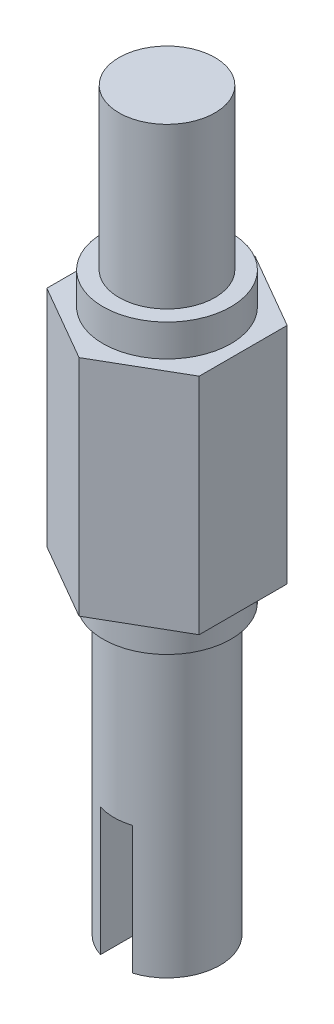
ISO-10303-21;
HEADER;
FILE_DESCRIPTION(('STEP AP214'),'2;1');
FILE_NAME('part.step','',(''),(''),'','','');
FILE_SCHEMA(('AUTOMOTIVE_DESIGN { 1 0 10303 214 1 1 1 1 }'));
ENDSEC;
DATA;
#1=APPLICATION_CONTEXT('core data for automotive mechanical design processes');
#2=APPLICATION_PROTOCOL_DEFINITION('international standard','automotive_design',2000,#1);
#3=PRODUCT_CONTEXT('',#1,'mechanical');
#4=PRODUCT('Part','Part','',(#3));
#5=PRODUCT_RELATED_PRODUCT_CATEGORY('part','',(#4));
#6=PRODUCT_DEFINITION_FORMATION('','',#4);
#7=PRODUCT_DEFINITION_CONTEXT('part definition',#1,'design');
#8=PRODUCT_DEFINITION('design','',#6,#7);
#9=PRODUCT_DEFINITION_SHAPE('','',#8);
#10=(LENGTH_UNIT() NAMED_UNIT(*) SI_UNIT(.MILLI.,.METRE.));
#11=(NAMED_UNIT(*) PLANE_ANGLE_UNIT() SI_UNIT($,.RADIAN.));
#12=(NAMED_UNIT(*) SI_UNIT($,.STERADIAN.) SOLID_ANGLE_UNIT());
#13=UNCERTAINTY_MEASURE_WITH_UNIT(LENGTH_MEASURE(1.E-05),#10,'distance_accuracy_value','');
#14=(GEOMETRIC_REPRESENTATION_CONTEXT(3) GLOBAL_UNCERTAINTY_ASSIGNED_CONTEXT((#13)) GLOBAL_UNIT_ASSIGNED_CONTEXT((#10,
#11,#12)) REPRESENTATION_CONTEXT('',''));
#15=CARTESIAN_POINT('',(0.,0.,0.));
#16=DIRECTION('',(0.,0.,1.));
#17=DIRECTION('',(1.,0.,0.));
#18=AXIS2_PLACEMENT_3D('',#15,#16,#17);
#19=CARTESIAN_POINT('',(0.,14.,5.49926131403119));
#20=DIRECTION('',(-0.5,0.,-0.866025403784438));
#21=DIRECTION('',(-0.866025403784438,0.,0.5));
#22=AXIS2_PLACEMENT_3D('',#19,#20,#21);
#23=PLANE('',#22);
#24=DIRECTION('',(0.866025403784438,0.,-0.5));
#25=VECTOR('',#24,1.);
#26=CARTESIAN_POINT('',(0.,0.,5.49926131403119));
#27=LINE('',#26,#25);
#28=CARTESIAN_POINT('',(0.,0.,5.49926131403119));
#29=VERTEX_POINT('',#28);
#30=CARTESIAN_POINT('',(4.7625,0.,2.74963065701559));
#31=VERTEX_POINT('',#30);
#32=EDGE_CURVE('E192',#29,#31,#27,.T.);
#33=ORIENTED_EDGE('',*,*,#32,.T.);
#34=DIRECTION('',(0.,-1.,0.));
#35=VECTOR('',#34,1.);
#36=CARTESIAN_POINT('',(4.7625,14.,2.74963065701559));
#37=LINE('',#36,#35);
#38=CARTESIAN_POINT('',(4.7625,14.,2.74963065701559));
#39=VERTEX_POINT('',#38);
#40=EDGE_CURVE('E196',#39,#31,#37,.T.);
#41=ORIENTED_EDGE('',*,*,#40,.F.);
#42=DIRECTION('',(0.866025403784438,0.,-0.5));
#43=VECTOR('',#42,1.);
#44=CARTESIAN_POINT('',(0.,14.,5.49926131403119));
#45=LINE('',#44,#43);
#46=CARTESIAN_POINT('',(0.,14.,5.49926131403119));
#47=VERTEX_POINT('',#46);
#48=EDGE_CURVE('E197',#47,#39,#45,.T.);
#49=ORIENTED_EDGE('',*,*,#48,.F.);
#50=DIRECTION('',(0.,-1.,0.));
#51=VECTOR('',#50,1.);
#52=CARTESIAN_POINT('',(0.,14.,5.49926131403119));
#53=LINE('',#52,#51);
#54=EDGE_CURVE('E217',#47,#29,#53,.T.);
#55=ORIENTED_EDGE('',*,*,#54,.T.);
#56=EDGE_LOOP('',(#33,#41,#49,#55));
#57=FACE_BOUND('',#56,.T.);
#58=ADVANCED_FACE('F58',(#57),#23,.F.);
#59=CARTESIAN_POINT('',(4.7625,14.,2.74963065701559));
#60=DIRECTION('',(-1.,0.,0.));
#61=DIRECTION('',(0.,0.,1.));
#62=AXIS2_PLACEMENT_3D('',#59,#60,#61);
#63=PLANE('',#62);
#64=DIRECTION('',(0.,0.,-1.));
#65=VECTOR('',#64,1.);
#66=CARTESIAN_POINT('',(4.7625,0.,2.74963065701559));
#67=LINE('',#66,#65);
#68=CARTESIAN_POINT('',(4.7625,0.,-2.7496306570156));
#69=VERTEX_POINT('',#68);
#70=EDGE_CURVE('E221',#31,#69,#67,.T.);
#71=ORIENTED_EDGE('',*,*,#70,.T.);
#72=DIRECTION('',(0.,-1.,0.));
#73=VECTOR('',#72,1.);
#74=CARTESIAN_POINT('',(4.7625,14.,-2.7496306570156));
#75=LINE('',#74,#73);
#76=CARTESIAN_POINT('',(4.7625,14.,-2.7496306570156));
#77=VERTEX_POINT('',#76);
#78=EDGE_CURVE('E250',#77,#69,#75,.T.);
#79=ORIENTED_EDGE('',*,*,#78,.F.);
#80=DIRECTION('',(0.,0.,-1.));
#81=VECTOR('',#80,1.);
#82=CARTESIAN_POINT('',(4.7625,14.,2.74963065701559));
#83=LINE('',#82,#81);
#84=EDGE_CURVE('E201',#39,#77,#83,.T.);
#85=ORIENTED_EDGE('',*,*,#84,.F.);
#86=ORIENTED_EDGE('',*,*,#40,.T.);
#87=EDGE_LOOP('',(#71,#79,#85,#86));
#88=FACE_BOUND('',#87,.T.);
#89=ADVANCED_FACE('F286',(#88),#63,.F.);
#90=CARTESIAN_POINT('',(4.7625,14.,-2.7496306570156));
#91=DIRECTION('',(-0.5,0.,0.866025403784439));
#92=DIRECTION('',(0.866025403784439,0.,0.5));
#93=AXIS2_PLACEMENT_3D('',#90,#91,#92);
#94=PLANE('',#93);
#95=DIRECTION('',(-0.866025403784439,0.,-0.5));
#96=VECTOR('',#95,1.);
#97=CARTESIAN_POINT('',(4.7625,0.,-2.7496306570156));
#98=LINE('',#97,#96);
#99=CARTESIAN_POINT('',(0.,0.,-5.49926131403119));
#100=VERTEX_POINT('',#99);
#101=EDGE_CURVE('E224',#69,#100,#98,.T.);
#102=ORIENTED_EDGE('',*,*,#101,.T.);
#103=DIRECTION('',(0.,-1.,0.));
#104=VECTOR('',#103,1.);
#105=CARTESIAN_POINT('',(0.,14.,-5.49926131403119));
#106=LINE('',#105,#104);
#107=CARTESIAN_POINT('',(0.,14.,-5.49926131403119));
#108=VERTEX_POINT('',#107);
#109=EDGE_CURVE('E246',#108,#100,#106,.T.);
#110=ORIENTED_EDGE('',*,*,#109,.F.);
#111=DIRECTION('',(-0.866025403784439,0.,-0.5));
#112=VECTOR('',#111,1.);
#113=CARTESIAN_POINT('',(4.7625,14.,-2.7496306570156));
#114=LINE('',#113,#112);
#115=EDGE_CURVE('E205',#77,#108,#114,.T.);
#116=ORIENTED_EDGE('',*,*,#115,.F.);
#117=ORIENTED_EDGE('',*,*,#78,.T.);
#118=EDGE_LOOP('',(#102,#110,#116,#117));
#119=FACE_BOUND('',#118,.T.);
#120=ADVANCED_FACE('F291',(#119),#94,.F.);
#121=CARTESIAN_POINT('',(0.,14.,-5.49926131403119));
#122=DIRECTION('',(0.5,0.,0.866025403784439));
#123=DIRECTION('',(0.866025403784439,0.,-0.5));
#124=AXIS2_PLACEMENT_3D('',#121,#122,#123);
#125=PLANE('',#124);
#126=DIRECTION('',(-0.866025403784439,0.,0.5));
#127=VECTOR('',#126,1.);
#128=CARTESIAN_POINT('',(0.,0.,-5.49926131403119));
#129=LINE('',#128,#127);
#130=CARTESIAN_POINT('',(-4.7625,0.,-2.74963065701559));
#131=VERTEX_POINT('',#130);
#132=EDGE_CURVE('E227',#100,#131,#129,.T.);
#133=ORIENTED_EDGE('',*,*,#132,.T.);
#134=DIRECTION('',(0.,-1.,0.));
#135=VECTOR('',#134,1.);
#136=CARTESIAN_POINT('',(-4.7625,14.,-2.74963065701559));
#137=LINE('',#136,#135);
#138=CARTESIAN_POINT('',(-4.7625,14.,-2.74963065701559));
#139=VERTEX_POINT('',#138);
#140=EDGE_CURVE('E242',#139,#131,#137,.T.);
#141=ORIENTED_EDGE('',*,*,#140,.F.);
#142=DIRECTION('',(-0.866025403784439,0.,0.5));
#143=VECTOR('',#142,1.);
#144=CARTESIAN_POINT('',(0.,14.,-5.49926131403119));
#145=LINE('',#144,#143);
#146=EDGE_CURVE('E208',#108,#139,#145,.T.);
#147=ORIENTED_EDGE('',*,*,#146,.F.);
#148=ORIENTED_EDGE('',*,*,#109,.T.);
#149=EDGE_LOOP('',(#133,#141,#147,#148));
#150=FACE_BOUND('',#149,.T.);
#151=ADVANCED_FACE('F316',(#150),#125,.F.);
#152=CARTESIAN_POINT('',(-4.7625,14.,-2.74963065701559));
#153=DIRECTION('',(1.,0.,0.));
#154=DIRECTION('',(0.,0.,-1.));
#155=AXIS2_PLACEMENT_3D('',#152,#153,#154);
#156=PLANE('',#155);
#157=DIRECTION('',(0.,0.,1.));
#158=VECTOR('',#157,1.);
#159=CARTESIAN_POINT('',(-4.7625,0.,-2.74963065701559));
#160=LINE('',#159,#158);
#161=CARTESIAN_POINT('',(-4.7625,0.,2.74963065701559));
#162=VERTEX_POINT('',#161);
#163=EDGE_CURVE('E230',#131,#162,#160,.T.);
#164=ORIENTED_EDGE('',*,*,#163,.T.);
#165=DIRECTION('',(0.,-1.,0.));
#166=VECTOR('',#165,1.);
#167=CARTESIAN_POINT('',(-4.7625,14.,2.74963065701559));
#168=LINE('',#167,#166);
#169=CARTESIAN_POINT('',(-4.7625,14.,2.74963065701559));
#170=VERTEX_POINT('',#169);
#171=EDGE_CURVE('E238',#170,#162,#168,.T.);
#172=ORIENTED_EDGE('',*,*,#171,.F.);
#173=DIRECTION('',(0.,0.,1.));
#174=VECTOR('',#173,1.);
#175=CARTESIAN_POINT('',(-4.7625,14.,-2.74963065701559));
#176=LINE('',#175,#174);
#177=EDGE_CURVE('E211',#139,#170,#176,.T.);
#178=ORIENTED_EDGE('',*,*,#177,.F.);
#179=ORIENTED_EDGE('',*,*,#140,.T.);
#180=EDGE_LOOP('',(#164,#172,#178,#179));
#181=FACE_BOUND('',#180,.T.);
#182=ADVANCED_FACE('F313',(#181),#156,.F.);
#183=CARTESIAN_POINT('',(-4.7625,14.,2.74963065701559));
#184=DIRECTION('',(0.5,0.,-0.866025403784439));
#185=DIRECTION('',(-0.866025403784439,0.,-0.5));
#186=AXIS2_PLACEMENT_3D('',#183,#184,#185);
#187=PLANE('',#186);
#188=DIRECTION('',(0.866025403784439,0.,0.5));
#189=VECTOR('',#188,1.);
#190=CARTESIAN_POINT('',(-4.7625,0.,2.74963065701559));
#191=LINE('',#190,#189);
#192=EDGE_CURVE('E202',#162,#29,#191,.T.);
#193=ORIENTED_EDGE('',*,*,#192,.T.);
#194=ORIENTED_EDGE('',*,*,#54,.F.);
#195=DIRECTION('',(0.866025403784439,0.,0.5));
#196=VECTOR('',#195,1.);
#197=CARTESIAN_POINT('',(-4.7625,14.,2.74963065701559));
#198=LINE('',#197,#196);
#199=EDGE_CURVE('E214',#170,#47,#198,.T.);
#200=ORIENTED_EDGE('',*,*,#199,.F.);
#201=ORIENTED_EDGE('',*,*,#171,.T.);
#202=EDGE_LOOP('',(#193,#194,#200,#201));
#203=FACE_BOUND('',#202,.T.);
#204=ADVANCED_FACE('F311',(#203),#187,.F.);
#205=CARTESIAN_POINT('',(0.,14.,0.));
#206=DIRECTION('',(0.,1.,0.));
#207=DIRECTION('',(0.,0.,1.));
#208=AXIS2_PLACEMENT_3D('',#205,#206,#207);
#209=PLANE('',#208);
#210=CARTESIAN_POINT('',(0.,14.,0.));
#211=DIRECTION('',(0.,1.,0.));
#212=DIRECTION('',(0.,0.,1.));
#213=AXIS2_PLACEMENT_3D('',#210,#211,#212);
#214=CIRCLE('',#213,4.);
#215=CARTESIAN_POINT('',(0.,14.,4.));
#216=VERTEX_POINT('',#215);
#217=EDGE_CURVE('E180',#216,#216,#214,.T.);
#218=ORIENTED_EDGE('',*,*,#217,.F.);
#219=EDGE_LOOP('',(#218));
#220=FACE_BOUND('',#219,.T.);
#221=ORIENTED_EDGE('',*,*,#48,.T.);
#222=ORIENTED_EDGE('',*,*,#84,.T.);
#223=ORIENTED_EDGE('',*,*,#115,.T.);
#224=ORIENTED_EDGE('',*,*,#146,.T.);
#225=ORIENTED_EDGE('',*,*,#177,.T.);
#226=ORIENTED_EDGE('',*,*,#199,.T.);
#227=EDGE_LOOP('',(#221,#222,#223,#224,#225,#226));
#228=FACE_BOUND('',#227,.T.);
#229=ADVANCED_FACE('F306',(#220,#228),#209,.T.);
#230=CARTESIAN_POINT('',(0.,0.,0.));
#231=DIRECTION('',(0.,1.,0.));
#232=DIRECTION('',(0.,0.,1.));
#233=AXIS2_PLACEMENT_3D('',#230,#231,#232);
#234=PLANE('',#233);
#235=CARTESIAN_POINT('',(0.,0.,0.));
#236=DIRECTION('',(0.,-1.,0.));
#237=DIRECTION('',(0.,0.,-1.));
#238=AXIS2_PLACEMENT_3D('',#235,#236,#237);
#239=CIRCLE('',#238,4.);
#240=CARTESIAN_POINT('',(0.,0.,-4.));
#241=VERTEX_POINT('',#240);
#242=EDGE_CURVE('E184',#241,#241,#239,.T.);
#243=ORIENTED_EDGE('',*,*,#242,.F.);
#244=EDGE_LOOP('',(#243));
#245=FACE_BOUND('',#244,.T.);
#246=ORIENTED_EDGE('',*,*,#32,.F.);
#247=ORIENTED_EDGE('',*,*,#192,.F.);
#248=ORIENTED_EDGE('',*,*,#163,.F.);
#249=ORIENTED_EDGE('',*,*,#132,.F.);
#250=ORIENTED_EDGE('',*,*,#101,.F.);
#251=ORIENTED_EDGE('',*,*,#70,.F.);
#252=EDGE_LOOP('',(#246,#247,#248,#249,#250,#251));
#253=FACE_BOUND('',#252,.T.);
#254=ADVANCED_FACE('F299',(#245,#253),#234,.F.);
#255=CARTESIAN_POINT('',(0.,-2.,0.));
#256=DIRECTION('',(0.,1.,0.));
#257=DIRECTION('',(0.,0.,1.));
#258=AXIS2_PLACEMENT_3D('',#255,#256,#257);
#259=CYLINDRICAL_SURFACE('',#258,4.);
#260=CARTESIAN_POINT('',(0.,-2.,0.));
#261=DIRECTION('',(0.,-1.,0.));
#262=DIRECTION('',(0.,0.,-1.));
#263=AXIS2_PLACEMENT_3D('',#260,#261,#262);
#264=CIRCLE('',#263,4.);
#265=CARTESIAN_POINT('',(0.,-2.,-4.));
#266=VERTEX_POINT('',#265);
#267=EDGE_CURVE('E188',#266,#266,#264,.T.);
#268=ORIENTED_EDGE('',*,*,#267,.F.);
#269=EDGE_LOOP('',(#268));
#270=FACE_BOUND('',#269,.T.);
#271=ORIENTED_EDGE('',*,*,#242,.T.);
#272=EDGE_LOOP('',(#271));
#273=FACE_BOUND('',#272,.T.);
#274=ADVANCED_FACE('F333',(#270,#273),#259,.T.);
#275=CARTESIAN_POINT('',(0.,-2.,0.));
#276=DIRECTION('',(0.,-1.,0.));
#277=DIRECTION('',(0.,0.,-1.));
#278=AXIS2_PLACEMENT_3D('',#275,#276,#277);
#279=PLANE('',#278);
#280=CARTESIAN_POINT('',(0.,-2.,0.));
#281=DIRECTION('',(0.,-1.,0.));
#282=DIRECTION('',(0.,0.,-1.));
#283=AXIS2_PLACEMENT_3D('',#280,#281,#282);
#284=CIRCLE('',#283,3.31452848357847);
#285=CARTESIAN_POINT('',(0.,-2.,-3.31452848357847));
#286=VERTEX_POINT('',#285);
#287=EDGE_CURVE('E187',#286,#286,#284,.F.);
#288=ORIENTED_EDGE('',*,*,#287,.T.);
#289=EDGE_LOOP('',(#288));
#290=FACE_BOUND('',#289,.T.);
#291=ORIENTED_EDGE('',*,*,#267,.T.);
#292=EDGE_LOOP('',(#291));
#293=FACE_BOUND('',#292,.T.);
#294=ADVANCED_FACE('F282',(#290,#293),#279,.T.);
#295=CARTESIAN_POINT('',(0.,-12.,0.));
#296=DIRECTION('',(0.,1.,0.));
#297=DIRECTION('',(0.,0.,1.));
#298=AXIS2_PLACEMENT_3D('',#295,#296,#297);
#299=CYLINDRICAL_SURFACE('',#298,3.31452848357847);
#300=ORIENTED_EDGE('',*,*,#287,.F.);
#301=EDGE_LOOP('',(#300));
#302=FACE_BOUND('',#301,.T.);
#303=CARTESIAN_POINT('',(0.,-12.,0.));
#304=DIRECTION('',(0.,-1.,0.));
#305=DIRECTION('',(0.,0.,-1.));
#306=AXIS2_PLACEMENT_3D('',#303,#304,#305);
#307=CIRCLE('',#306,3.31452848357847);
#308=CARTESIAN_POINT('',(1.,-12.,3.16007896554073));
#309=VERTEX_POINT('',#308);
#310=CARTESIAN_POINT('',(-0.999999999999999,-12.,3.16007896554073));
#311=VERTEX_POINT('',#310);
#312=EDGE_CURVE('E179',#309,#311,#307,.T.);
#313=ORIENTED_EDGE('',*,*,#312,.F.);
#314=DIRECTION('',(0.,1.,0.));
#315=VECTOR('',#314,1.);
#316=CARTESIAN_POINT('',(1.,-37.266333573426,3.16007896554073));
#317=LINE('',#316,#315);
#318=CARTESIAN_POINT('',(1.,-20.,3.16007896554073));
#319=VERTEX_POINT('',#318);
#320=EDGE_CURVE('E142',#319,#309,#317,.T.);
#321=ORIENTED_EDGE('',*,*,#320,.F.);
#322=CARTESIAN_POINT('',(0.,-20.,0.));
#323=DIRECTION('',(0.,-1.,0.));
#324=DIRECTION('',(0.,0.,-1.));
#325=AXIS2_PLACEMENT_3D('',#322,#323,#324);
#326=CIRCLE('',#325,3.31452848357847);
#327=CARTESIAN_POINT('',(-0.999999999999999,-20.,3.16007896554073));
#328=VERTEX_POINT('',#327);
#329=EDGE_CURVE('E137',#328,#319,#326,.T.);
#330=ORIENTED_EDGE('',*,*,#329,.F.);
#331=DIRECTION('',(0.,1.,0.));
#332=VECTOR('',#331,1.);
#333=CARTESIAN_POINT('',(-0.999999999999999,-37.266333573426,3.16007896554073));
#334=LINE('',#333,#332);
#335=EDGE_CURVE('E161',#328,#311,#334,.T.);
#336=ORIENTED_EDGE('',*,*,#335,.T.);
#337=EDGE_LOOP('',(#313,#321,#330,#336));
#338=FACE_BOUND('',#337,.T.);
#339=ADVANCED_FACE('F270',(#302,#338),#299,.T.);
#340=CARTESIAN_POINT('',(0.,-12.,0.));
#341=DIRECTION('',(0.,-1.,0.));
#342=DIRECTION('',(0.,0.,-1.));
#343=AXIS2_PLACEMENT_3D('',#340,#341,#342);
#344=PLANE('',#343);
#345=DIRECTION('',(0.,0.,-1.));
#346=VECTOR('',#345,1.);
#347=CARTESIAN_POINT('',(1.,-12.,0.));
#348=LINE('',#347,#346);
#349=CARTESIAN_POINT('',(1.,-12.,1.16007896554073));
#350=VERTEX_POINT('',#349);
#351=EDGE_CURVE('E13',#309,#350,#348,.T.);
#352=ORIENTED_EDGE('',*,*,#351,.F.);
#353=ORIENTED_EDGE('',*,*,#312,.T.);
#354=DIRECTION('',(0.,0.,1.));
#355=VECTOR('',#354,1.);
#356=CARTESIAN_POINT('',(-1.,-12.,0.));
#357=LINE('',#356,#355);
#358=CARTESIAN_POINT('',(-1.,-12.,1.16007896554073));
#359=VERTEX_POINT('',#358);
#360=EDGE_CURVE('E76',#359,#311,#357,.T.);
#361=ORIENTED_EDGE('',*,*,#360,.F.);
#362=DIRECTION('',(-1.,0.,0.));
#363=VECTOR('',#362,1.);
#364=CARTESIAN_POINT('',(0.,-12.,1.16007896554073));
#365=LINE('',#364,#363);
#366=EDGE_CURVE('E66',#350,#359,#365,.T.);
#367=ORIENTED_EDGE('',*,*,#366,.F.);
#368=EDGE_LOOP('',(#352,#353,#361,#367));
#369=FACE_BOUND('',#368,.T.);
#370=ADVANCED_FACE('F271',(#369),#344,.T.);
#371=CARTESIAN_POINT('',(0.,16.,0.));
#372=DIRECTION('',(0.,-1.,0.));
#373=DIRECTION('',(0.,0.,-1.));
#374=AXIS2_PLACEMENT_3D('',#371,#372,#373);
#375=CYLINDRICAL_SURFACE('',#374,4.);
#376=CARTESIAN_POINT('',(0.,16.,0.));
#377=DIRECTION('',(0.,1.,0.));
#378=DIRECTION('',(0.,0.,1.));
#379=AXIS2_PLACEMENT_3D('',#376,#377,#378);
#380=CIRCLE('',#379,4.);
#381=CARTESIAN_POINT('',(0.,16.,4.));
#382=VERTEX_POINT('',#381);
#383=EDGE_CURVE('E175',#382,#382,#380,.T.);
#384=ORIENTED_EDGE('',*,*,#383,.F.);
#385=EDGE_LOOP('',(#384));
#386=FACE_BOUND('',#385,.T.);
#387=ORIENTED_EDGE('',*,*,#217,.T.);
#388=EDGE_LOOP('',(#387));
#389=FACE_BOUND('',#388,.T.);
#390=ADVANCED_FACE('F273',(#386,#389),#375,.T.);
#391=CARTESIAN_POINT('',(0.,16.,0.));
#392=DIRECTION('',(0.,1.,0.));
#393=DIRECTION('',(0.,0.,1.));
#394=AXIS2_PLACEMENT_3D('',#391,#392,#393);
#395=PLANE('',#394);
#396=CARTESIAN_POINT('',(0.,16.,0.));
#397=DIRECTION('',(0.,1.,0.));
#398=DIRECTION('',(0.,0.,1.));
#399=AXIS2_PLACEMENT_3D('',#396,#397,#398);
#400=CIRCLE('',#399,3.);
#401=CARTESIAN_POINT('',(0.,16.,3.));
#402=VERTEX_POINT('',#401);
#403=EDGE_CURVE('E174',#402,#402,#400,.F.);
#404=ORIENTED_EDGE('',*,*,#403,.T.);
#405=EDGE_LOOP('',(#404));
#406=FACE_BOUND('',#405,.T.);
#407=ORIENTED_EDGE('',*,*,#383,.T.);
#408=EDGE_LOOP('',(#407));
#409=FACE_BOUND('',#408,.T.);
#410=ADVANCED_FACE('F279',(#406,#409),#395,.T.);
#411=CARTESIAN_POINT('',(0.,44.4852813742386,0.));
#412=DIRECTION('',(0.,-1.,0.));
#413=DIRECTION('',(0.,0.,-1.));
#414=AXIS2_PLACEMENT_3D('',#411,#412,#413);
#415=CYLINDRICAL_SURFACE('',#414,3.);
#416=ORIENTED_EDGE('',*,*,#403,.F.);
#417=EDGE_LOOP('',(#416));
#418=FACE_BOUND('',#417,.T.);
#419=CARTESIAN_POINT('',(0.,26.,0.));
#420=DIRECTION('',(0.,1.,0.));
#421=DIRECTION('',(0.,0.,1.));
#422=AXIS2_PLACEMENT_3D('',#419,#420,#421);
#423=CIRCLE('',#422,3.);
#424=CARTESIAN_POINT('',(0.,26.,3.));
#425=VERTEX_POINT('',#424);
#426=EDGE_CURVE('E170',#425,#425,#423,.T.);
#427=ORIENTED_EDGE('',*,*,#426,.F.);
#428=EDGE_LOOP('',(#427));
#429=FACE_BOUND('',#428,.T.);
#430=ADVANCED_FACE('F404',(#418,#429),#415,.T.);
#431=CARTESIAN_POINT('',(0.,26.,0.));
#432=DIRECTION('',(0.,1.,0.));
#433=DIRECTION('',(0.,0.,1.));
#434=AXIS2_PLACEMENT_3D('',#431,#432,#433);
#435=PLANE('',#434);
#436=ORIENTED_EDGE('',*,*,#426,.T.);
#437=EDGE_LOOP('',(#436));
#438=FACE_BOUND('',#437,.T.);
#439=ADVANCED_FACE('F374',(#438),#435,.T.);
#440=CARTESIAN_POINT('',(0.,-20.,0.));
#441=DIRECTION('',(0.,-1.,0.));
#442=DIRECTION('',(0.,0.,-1.));
#443=AXIS2_PLACEMENT_3D('',#440,#441,#442);
#444=PLANE('',#443);
#445=DIRECTION('',(0.,0.,-1.));
#446=VECTOR('',#445,1.);
#447=CARTESIAN_POINT('',(-1.,-20.,3.16007896554073));
#448=LINE('',#447,#446);
#449=CARTESIAN_POINT('',(-1.,-20.,1.16007896554073));
#450=VERTEX_POINT('',#449);
#451=EDGE_CURVE('E159',#328,#450,#448,.T.);
#452=ORIENTED_EDGE('',*,*,#451,.F.);
#453=ORIENTED_EDGE('',*,*,#329,.T.);
#454=DIRECTION('',(0.,0.,1.));
#455=VECTOR('',#454,1.);
#456=CARTESIAN_POINT('',(1.,-20.,1.16007896554073));
#457=LINE('',#456,#455);
#458=CARTESIAN_POINT('',(1.,-20.,1.16007896554073));
#459=VERTEX_POINT('',#458);
#460=EDGE_CURVE('E130',#459,#319,#457,.T.);
#461=ORIENTED_EDGE('',*,*,#460,.F.);
#462=DIRECTION('',(1.,0.,0.));
#463=VECTOR('',#462,1.);
#464=CARTESIAN_POINT('',(-1.,-20.,1.16007896554073));
#465=LINE('',#464,#463);
#466=EDGE_CURVE('E134',#450,#459,#465,.T.);
#467=ORIENTED_EDGE('',*,*,#466,.F.);
#468=EDGE_LOOP('',(#452,#453,#461,#467));
#469=FACE_BOUND('',#468,.T.);
#470=ADVANCED_FACE('F132',(#469),#444,.T.);
#471=CARTESIAN_POINT('',(-1.,-37.266333573426,1.16007896554073));
#472=DIRECTION('',(0.,0.,1.));
#473=DIRECTION('',(1.,0.,0.));
#474=AXIS2_PLACEMENT_3D('',#471,#472,#473);
#475=PLANE('',#474);
#476=DIRECTION('',(0.,1.,0.));
#477=VECTOR('',#476,1.);
#478=CARTESIAN_POINT('',(1.,-37.266333573426,1.16007896554073));
#479=LINE('',#478,#477);
#480=EDGE_CURVE('E143',#459,#350,#479,.T.);
#481=ORIENTED_EDGE('',*,*,#480,.T.);
#482=ORIENTED_EDGE('',*,*,#366,.T.);
#483=DIRECTION('',(0.,1.,0.));
#484=VECTOR('',#483,1.);
#485=CARTESIAN_POINT('',(-1.,-37.266333573426,1.16007896554073));
#486=LINE('',#485,#484);
#487=EDGE_CURVE('E153',#450,#359,#486,.T.);
#488=ORIENTED_EDGE('',*,*,#487,.F.);
#489=ORIENTED_EDGE('',*,*,#466,.T.);
#490=EDGE_LOOP('',(#481,#482,#488,#489));
#491=FACE_BOUND('',#490,.T.);
#492=ADVANCED_FACE('F151',(#491),#475,.T.);
#493=CARTESIAN_POINT('',(1.,-37.266333573426,1.16007896554073));
#494=DIRECTION('',(-1.,0.,0.));
#495=DIRECTION('',(0.,0.,1.));
#496=AXIS2_PLACEMENT_3D('',#493,#494,#495);
#497=PLANE('',#496);
#498=ORIENTED_EDGE('',*,*,#320,.T.);
#499=ORIENTED_EDGE('',*,*,#351,.T.);
#500=ORIENTED_EDGE('',*,*,#480,.F.);
#501=ORIENTED_EDGE('',*,*,#460,.T.);
#502=EDGE_LOOP('',(#498,#499,#500,#501));
#503=FACE_BOUND('',#502,.T.);
#504=ADVANCED_FACE('F146',(#503),#497,.T.);
#505=CARTESIAN_POINT('',(-1.,-37.266333573426,3.16007896554073));
#506=DIRECTION('',(1.,0.,0.));
#507=DIRECTION('',(0.,0.,-1.));
#508=AXIS2_PLACEMENT_3D('',#505,#506,#507);
#509=PLANE('',#508);
#510=ORIENTED_EDGE('',*,*,#487,.T.);
#511=ORIENTED_EDGE('',*,*,#360,.T.);
#512=ORIENTED_EDGE('',*,*,#335,.F.);
#513=ORIENTED_EDGE('',*,*,#451,.T.);
#514=EDGE_LOOP('',(#510,#511,#512,#513));
#515=FACE_BOUND('',#514,.T.);
#516=ADVANCED_FACE('F266',(#515),#509,.T.);
#517=CLOSED_SHELL('',(#58,#89,#120,#151,#182,#204,#229,#254,#274,#294,#339,#370,#390,#410,#430,
#439,#470,#492,#504,#516));
#518=MANIFOLD_SOLID_BREP('B2',#517);
#519=ADVANCED_BREP_SHAPE_REPRESENTATION('',(#18,#518),#14);
#520=SHAPE_DEFINITION_REPRESENTATION(#9,#519);
ENDSEC;
END-ISO-10303-21;
